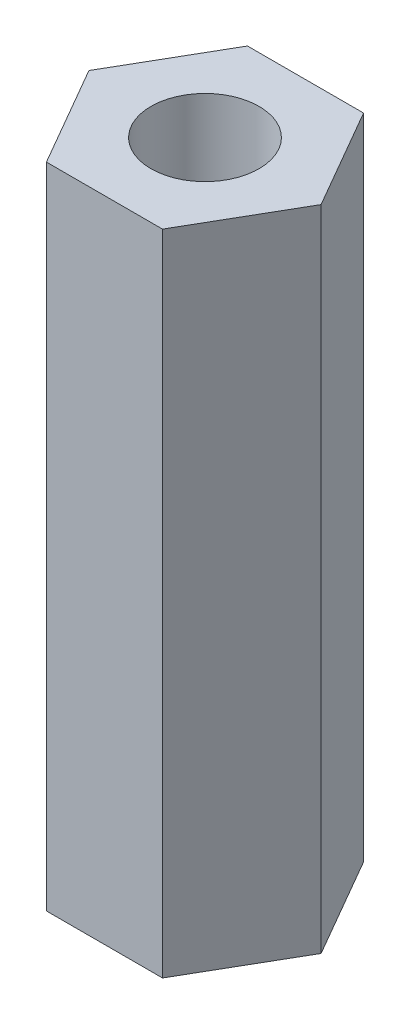
ISO-10303-21;
HEADER;
FILE_DESCRIPTION(('STEP AP214'),'2;1');
FILE_NAME('part.step','',(''),(''),'','','');
FILE_SCHEMA(('AUTOMOTIVE_DESIGN { 1 0 10303 214 1 1 1 1 }'));
ENDSEC;
DATA;
#1=APPLICATION_CONTEXT('core data for automotive mechanical design processes');
#2=APPLICATION_PROTOCOL_DEFINITION('international standard','automotive_design',2000,#1);
#3=PRODUCT_CONTEXT('',#1,'mechanical');
#4=PRODUCT('Part','Part','',(#3));
#5=PRODUCT_RELATED_PRODUCT_CATEGORY('part','',(#4));
#6=PRODUCT_DEFINITION_FORMATION('','',#4);
#7=PRODUCT_DEFINITION_CONTEXT('part definition',#1,'design');
#8=PRODUCT_DEFINITION('design','',#6,#7);
#9=PRODUCT_DEFINITION_SHAPE('','',#8);
#10=(LENGTH_UNIT() NAMED_UNIT(*) SI_UNIT(.MILLI.,.METRE.));
#11=(NAMED_UNIT(*) PLANE_ANGLE_UNIT() SI_UNIT($,.RADIAN.));
#12=(NAMED_UNIT(*) SI_UNIT($,.STERADIAN.) SOLID_ANGLE_UNIT());
#13=UNCERTAINTY_MEASURE_WITH_UNIT(LENGTH_MEASURE(1.E-05),#10,'distance_accuracy_value','');
#14=(GEOMETRIC_REPRESENTATION_CONTEXT(3) GLOBAL_UNCERTAINTY_ASSIGNED_CONTEXT((#13)) GLOBAL_UNIT_ASSIGNED_CONTEXT((#10,
#11,#12)) REPRESENTATION_CONTEXT('',''));
#15=CARTESIAN_POINT('',(0.,0.,0.));
#16=DIRECTION('',(0.,0.,1.));
#17=DIRECTION('',(1.,0.,0.));
#18=AXIS2_PLACEMENT_3D('',#15,#16,#17);
#19=CARTESIAN_POINT('',(1.34233937586591,15.,2.32499999999999));
#20=DIRECTION('',(-0.866025403784442,0.,-0.499999999999995));
#21=DIRECTION('',(-0.499999999999995,0.,0.866025403784442));
#22=AXIS2_PLACEMENT_3D('',#19,#20,#21);
#23=PLANE('',#22);
#24=DIRECTION('',(0.499999999999995,0.,-0.866025403784442));
#25=VECTOR('',#24,1.);
#26=CARTESIAN_POINT('',(1.34233937586591,0.,2.32499999999999));
#27=LINE('',#26,#25);
#28=CARTESIAN_POINT('',(1.34233937586591,0.,2.32499999999999));
#29=VERTEX_POINT('',#28);
#30=CARTESIAN_POINT('',(2.68467875173176,0.,0.));
#31=VERTEX_POINT('',#30);
#32=EDGE_CURVE('E128',#29,#31,#27,.T.);
#33=ORIENTED_EDGE('',*,*,#32,.T.);
#34=DIRECTION('',(0.,-1.,0.));
#35=VECTOR('',#34,1.);
#36=CARTESIAN_POINT('',(2.68467875173176,15.,0.));
#37=LINE('',#36,#35);
#38=CARTESIAN_POINT('',(2.68467875173176,15.,0.));
#39=VERTEX_POINT('',#38);
#40=EDGE_CURVE('E11',#39,#31,#37,.T.);
#41=ORIENTED_EDGE('',*,*,#40,.F.);
#42=DIRECTION('',(0.499999999999995,0.,-0.866025403784442));
#43=VECTOR('',#42,1.);
#44=CARTESIAN_POINT('',(1.34233937586591,15.,2.32499999999999));
#45=LINE('',#44,#43);
#46=CARTESIAN_POINT('',(1.34233937586591,15.,2.32499999999999));
#47=VERTEX_POINT('',#46);
#48=EDGE_CURVE('E145',#47,#39,#45,.T.);
#49=ORIENTED_EDGE('',*,*,#48,.F.);
#50=DIRECTION('',(0.,-1.,0.));
#51=VECTOR('',#50,1.);
#52=CARTESIAN_POINT('',(1.34233937586591,15.,2.32499999999999));
#53=LINE('',#52,#51);
#54=EDGE_CURVE('E124',#47,#29,#53,.T.);
#55=ORIENTED_EDGE('',*,*,#54,.T.);
#56=EDGE_LOOP('',(#33,#41,#49,#55));
#57=FACE_BOUND('',#56,.T.);
#58=ADVANCED_FACE('F39',(#57),#23,.F.);
#59=CARTESIAN_POINT('',(2.68467875173176,15.,0.));
#60=DIRECTION('',(-0.866025403784438,0.,0.500000000000001));
#61=DIRECTION('',(0.500000000000001,0.,0.866025403784438));
#62=AXIS2_PLACEMENT_3D('',#59,#60,#61);
#63=PLANE('',#62);
#64=DIRECTION('',(-0.500000000000001,0.,-0.866025403784438));
#65=VECTOR('',#64,1.);
#66=CARTESIAN_POINT('',(2.68467875173176,0.,0.));
#67=LINE('',#66,#65);
#68=CARTESIAN_POINT('',(1.34233937586588,0.,-2.32500000000001));
#69=VERTEX_POINT('',#68);
#70=EDGE_CURVE('E132',#31,#69,#67,.T.);
#71=ORIENTED_EDGE('',*,*,#70,.T.);
#72=DIRECTION('',(0.,-1.,0.));
#73=VECTOR('',#72,1.);
#74=CARTESIAN_POINT('',(1.34233937586588,15.,-2.32500000000001));
#75=LINE('',#74,#73);
#76=CARTESIAN_POINT('',(1.34233937586588,15.,-2.32500000000001));
#77=VERTEX_POINT('',#76);
#78=EDGE_CURVE('E48',#77,#69,#75,.T.);
#79=ORIENTED_EDGE('',*,*,#78,.F.);
#80=DIRECTION('',(-0.500000000000001,0.,-0.866025403784438));
#81=VECTOR('',#80,1.);
#82=CARTESIAN_POINT('',(2.68467875173176,15.,0.));
#83=LINE('',#82,#81);
#84=EDGE_CURVE('E93',#39,#77,#83,.T.);
#85=ORIENTED_EDGE('',*,*,#84,.F.);
#86=ORIENTED_EDGE('',*,*,#40,.T.);
#87=EDGE_LOOP('',(#71,#79,#85,#86));
#88=FACE_BOUND('',#87,.T.);
#89=ADVANCED_FACE('F174',(#88),#63,.F.);
#90=CARTESIAN_POINT('',(1.34233937586588,15.,-2.32500000000001));
#91=DIRECTION('',(0.,0.,1.));
#92=DIRECTION('',(1.,0.,0.));
#93=AXIS2_PLACEMENT_3D('',#90,#91,#92);
#94=PLANE('',#93);
#95=DIRECTION('',(-1.,0.,0.));
#96=VECTOR('',#95,1.);
#97=CARTESIAN_POINT('',(1.34233937586588,0.,-2.32500000000001));
#98=LINE('',#97,#96);
#99=CARTESIAN_POINT('',(-1.34233937586589,0.,-2.325));
#100=VERTEX_POINT('',#99);
#101=EDGE_CURVE('E136',#69,#100,#98,.T.);
#102=ORIENTED_EDGE('',*,*,#101,.T.);
#103=DIRECTION('',(0.,-1.,0.));
#104=VECTOR('',#103,1.);
#105=CARTESIAN_POINT('',(-1.34233937586589,15.,-2.325));
#106=LINE('',#105,#104);
#107=CARTESIAN_POINT('',(-1.34233937586589,15.,-2.325));
#108=VERTEX_POINT('',#107);
#109=EDGE_CURVE('E117',#108,#100,#106,.T.);
#110=ORIENTED_EDGE('',*,*,#109,.F.);
#111=DIRECTION('',(-1.,0.,0.));
#112=VECTOR('',#111,1.);
#113=CARTESIAN_POINT('',(1.34233937586588,15.,-2.32500000000001));
#114=LINE('',#113,#112);
#115=EDGE_CURVE('E106',#77,#108,#114,.T.);
#116=ORIENTED_EDGE('',*,*,#115,.F.);
#117=ORIENTED_EDGE('',*,*,#78,.T.);
#118=EDGE_LOOP('',(#102,#110,#116,#117));
#119=FACE_BOUND('',#118,.T.);
#120=ADVANCED_FACE('F155',(#119),#94,.F.);
#121=CARTESIAN_POINT('',(-1.34233937586589,15.,-2.325));
#122=DIRECTION('',(0.866025403784442,0.,0.499999999999995));
#123=DIRECTION('',(0.499999999999995,0.,-0.866025403784442));
#124=AXIS2_PLACEMENT_3D('',#121,#122,#123);
#125=PLANE('',#124);
#126=DIRECTION('',(-0.499999999999995,0.,0.866025403784442));
#127=VECTOR('',#126,1.);
#128=CARTESIAN_POINT('',(-1.34233937586589,0.,-2.325));
#129=LINE('',#128,#127);
#130=CARTESIAN_POINT('',(-2.68467875173176,0.,0.));
#131=VERTEX_POINT('',#130);
#132=EDGE_CURVE('E115',#100,#131,#129,.T.);
#133=ORIENTED_EDGE('',*,*,#132,.T.);
#134=DIRECTION('',(0.,-1.,0.));
#135=VECTOR('',#134,1.);
#136=CARTESIAN_POINT('',(-2.68467875173176,15.,0.));
#137=LINE('',#136,#135);
#138=CARTESIAN_POINT('',(-2.68467875173176,15.,0.));
#139=VERTEX_POINT('',#138);
#140=EDGE_CURVE('E112',#139,#131,#137,.T.);
#141=ORIENTED_EDGE('',*,*,#140,.F.);
#142=DIRECTION('',(-0.499999999999995,0.,0.866025403784442));
#143=VECTOR('',#142,1.);
#144=CARTESIAN_POINT('',(-1.34233937586589,15.,-2.325));
#145=LINE('',#144,#143);
#146=EDGE_CURVE('E100',#108,#139,#145,.T.);
#147=ORIENTED_EDGE('',*,*,#146,.F.);
#148=ORIENTED_EDGE('',*,*,#109,.T.);
#149=EDGE_LOOP('',(#133,#141,#147,#148));
#150=FACE_BOUND('',#149,.T.);
#151=ADVANCED_FACE('F113',(#150),#125,.F.);
#152=CARTESIAN_POINT('',(-2.68467875173176,15.,0.));
#153=DIRECTION('',(0.866025403784435,0.,-0.500000000000007));
#154=DIRECTION('',(-0.500000000000007,0.,-0.866025403784435));
#155=AXIS2_PLACEMENT_3D('',#152,#153,#154);
#156=PLANE('',#155);
#157=DIRECTION('',(0.500000000000007,0.,0.866025403784435));
#158=VECTOR('',#157,1.);
#159=CARTESIAN_POINT('',(-2.68467875173176,0.,0.));
#160=LINE('',#159,#158);
#161=CARTESIAN_POINT('',(-1.34233937586586,0.,2.32500000000001));
#162=VERTEX_POINT('',#161);
#163=EDGE_CURVE('E79',#131,#162,#160,.T.);
#164=ORIENTED_EDGE('',*,*,#163,.T.);
#165=DIRECTION('',(0.,-1.,0.));
#166=VECTOR('',#165,1.);
#167=CARTESIAN_POINT('',(-1.34233937586586,15.,2.32500000000001));
#168=LINE('',#167,#166);
#169=CARTESIAN_POINT('',(-1.34233937586586,15.,2.32500000000001));
#170=VERTEX_POINT('',#169);
#171=EDGE_CURVE('E118',#170,#162,#168,.T.);
#172=ORIENTED_EDGE('',*,*,#171,.F.);
#173=DIRECTION('',(0.500000000000007,0.,0.866025403784435));
#174=VECTOR('',#173,1.);
#175=CARTESIAN_POINT('',(-2.68467875173176,15.,0.));
#176=LINE('',#175,#174);
#177=EDGE_CURVE('E104',#139,#170,#176,.T.);
#178=ORIENTED_EDGE('',*,*,#177,.F.);
#179=ORIENTED_EDGE('',*,*,#140,.T.);
#180=EDGE_LOOP('',(#164,#172,#178,#179));
#181=FACE_BOUND('',#180,.T.);
#182=ADVANCED_FACE('F120',(#181),#156,.F.);
#183=CARTESIAN_POINT('',(-1.34233937586586,15.,2.32500000000001));
#184=DIRECTION('',(0.,0.,-1.));
#185=DIRECTION('',(-1.,0.,0.));
#186=AXIS2_PLACEMENT_3D('',#183,#184,#185);
#187=PLANE('',#186);
#188=DIRECTION('',(1.,0.,0.));
#189=VECTOR('',#188,1.);
#190=CARTESIAN_POINT('',(-1.34233937586586,0.,2.32500000000001));
#191=LINE('',#190,#189);
#192=EDGE_CURVE('E85',#162,#29,#191,.T.);
#193=ORIENTED_EDGE('',*,*,#192,.T.);
#194=ORIENTED_EDGE('',*,*,#54,.F.);
#195=DIRECTION('',(1.,0.,0.));
#196=VECTOR('',#195,1.);
#197=CARTESIAN_POINT('',(-1.34233937586586,15.,2.32500000000001));
#198=LINE('',#197,#196);
#199=EDGE_CURVE('E56',#170,#47,#198,.T.);
#200=ORIENTED_EDGE('',*,*,#199,.F.);
#201=ORIENTED_EDGE('',*,*,#171,.T.);
#202=EDGE_LOOP('',(#193,#194,#200,#201));
#203=FACE_BOUND('',#202,.T.);
#204=ADVANCED_FACE('F162',(#203),#187,.F.);
#205=CARTESIAN_POINT('',(0.,15.,0.));
#206=DIRECTION('',(0.,1.,0.));
#207=DIRECTION('',(0.,0.,1.));
#208=AXIS2_PLACEMENT_3D('',#205,#206,#207);
#209=PLANE('',#208);
#210=CARTESIAN_POINT('',(0.,15.,0.));
#211=DIRECTION('',(0.,1.,0.));
#212=DIRECTION('',(0.,0.,1.));
#213=AXIS2_PLACEMENT_3D('',#210,#211,#212);
#214=CIRCLE('',#213,1.25);
#215=CARTESIAN_POINT('',(0.,15.,1.25));
#216=VERTEX_POINT('',#215);
#217=EDGE_CURVE('E133',#216,#216,#214,.T.);
#218=ORIENTED_EDGE('',*,*,#217,.F.);
#219=EDGE_LOOP('',(#218));
#220=FACE_BOUND('',#219,.T.);
#221=ORIENTED_EDGE('',*,*,#48,.T.);
#222=ORIENTED_EDGE('',*,*,#84,.T.);
#223=ORIENTED_EDGE('',*,*,#115,.T.);
#224=ORIENTED_EDGE('',*,*,#146,.T.);
#225=ORIENTED_EDGE('',*,*,#177,.T.);
#226=ORIENTED_EDGE('',*,*,#199,.T.);
#227=EDGE_LOOP('',(#221,#222,#223,#224,#225,#226));
#228=FACE_BOUND('',#227,.T.);
#229=ADVANCED_FACE('F102',(#220,#228),#209,.T.);
#230=CARTESIAN_POINT('',(0.,0.,0.));
#231=DIRECTION('',(0.,1.,0.));
#232=DIRECTION('',(0.,0.,1.));
#233=AXIS2_PLACEMENT_3D('',#230,#231,#232);
#234=PLANE('',#233);
#235=CARTESIAN_POINT('',(0.,0.,0.));
#236=DIRECTION('',(0.,1.,0.));
#237=DIRECTION('',(0.,0.,1.));
#238=AXIS2_PLACEMENT_3D('',#235,#236,#237);
#239=CIRCLE('',#238,1.25);
#240=CARTESIAN_POINT('',(0.,0.,1.25));
#241=VERTEX_POINT('',#240);
#242=EDGE_CURVE('E229',#241,#241,#239,.T.);
#243=ORIENTED_EDGE('',*,*,#242,.T.);
#244=EDGE_LOOP('',(#243));
#245=FACE_BOUND('',#244,.T.);
#246=ORIENTED_EDGE('',*,*,#32,.F.);
#247=ORIENTED_EDGE('',*,*,#192,.F.);
#248=ORIENTED_EDGE('',*,*,#163,.F.);
#249=ORIENTED_EDGE('',*,*,#132,.F.);
#250=ORIENTED_EDGE('',*,*,#101,.F.);
#251=ORIENTED_EDGE('',*,*,#70,.F.);
#252=EDGE_LOOP('',(#246,#247,#248,#249,#250,#251));
#253=FACE_BOUND('',#252,.T.);
#254=ADVANCED_FACE('F158',(#245,#253),#234,.F.);
#255=CARTESIAN_POINT('',(0.,0.,0.));
#256=DIRECTION('',(0.,1.,0.));
#257=DIRECTION('',(0.,0.,1.));
#258=AXIS2_PLACEMENT_3D('',#255,#256,#257);
#259=CYLINDRICAL_SURFACE('',#258,1.25);
#260=ORIENTED_EDGE('',*,*,#217,.T.);
#261=EDGE_LOOP('',(#260));
#262=FACE_BOUND('',#261,.T.);
#263=ORIENTED_EDGE('',*,*,#242,.F.);
#264=EDGE_LOOP('',(#263));
#265=FACE_BOUND('',#264,.T.);
#266=ADVANCED_FACE('F211',(#262,#265),#259,.F.);
#267=CLOSED_SHELL('',(#58,#89,#120,#151,#182,#204,#229,#254,#266));
#268=MANIFOLD_SOLID_BREP('B2',#267);
#269=ADVANCED_BREP_SHAPE_REPRESENTATION('',(#18,#268),#14);
#270=SHAPE_DEFINITION_REPRESENTATION(#9,#269);
ENDSEC;
END-ISO-10303-21;
